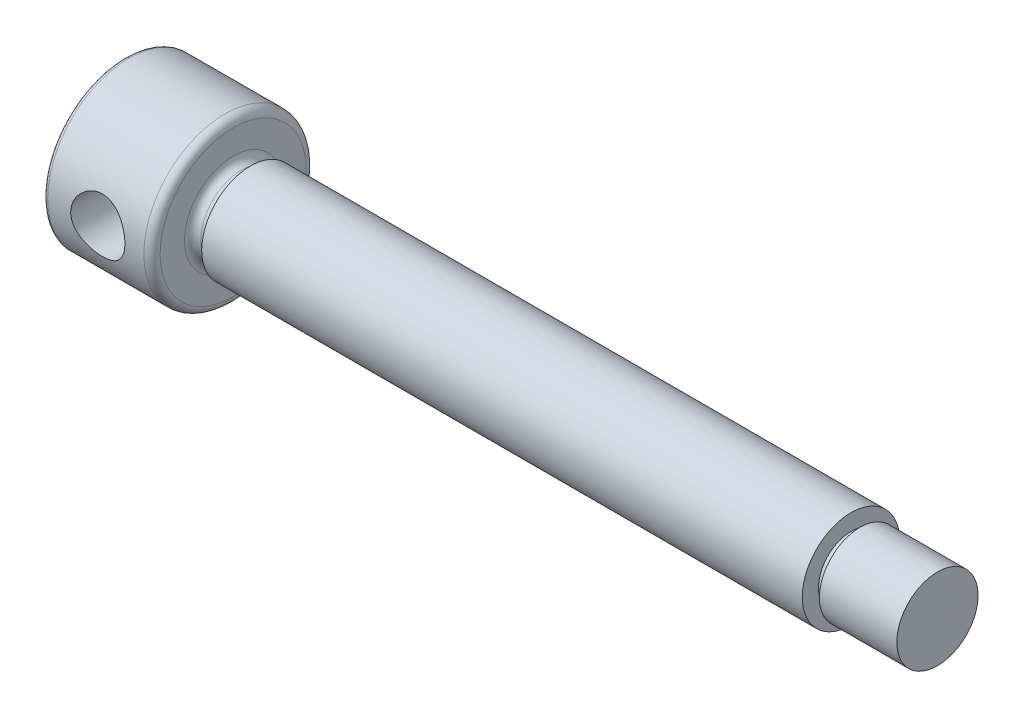
ISO-10303-21;
HEADER;
FILE_DESCRIPTION(('STEP AP214'),'2;1');
FILE_NAME('part.step','',(''),(''),'','','');
FILE_SCHEMA(('AUTOMOTIVE_DESIGN { 1 0 10303 214 1 1 1 1 }'));
ENDSEC;
DATA;
#1=APPLICATION_CONTEXT('core data for automotive mechanical design processes');
#2=APPLICATION_PROTOCOL_DEFINITION('international standard','automotive_design',2000,#1);
#3=PRODUCT_CONTEXT('',#1,'mechanical');
#4=PRODUCT('Part','Part','',(#3));
#5=PRODUCT_RELATED_PRODUCT_CATEGORY('part','',(#4));
#6=PRODUCT_DEFINITION_FORMATION('','',#4);
#7=PRODUCT_DEFINITION_CONTEXT('part definition',#1,'design');
#8=PRODUCT_DEFINITION('design','',#6,#7);
#9=PRODUCT_DEFINITION_SHAPE('','',#8);
#10=(LENGTH_UNIT() NAMED_UNIT(*) SI_UNIT(.MILLI.,.METRE.));
#11=(NAMED_UNIT(*) PLANE_ANGLE_UNIT() SI_UNIT($,.RADIAN.));
#12=(NAMED_UNIT(*) SI_UNIT($,.STERADIAN.) SOLID_ANGLE_UNIT());
#13=UNCERTAINTY_MEASURE_WITH_UNIT(LENGTH_MEASURE(1.E-05),#10,'distance_accuracy_value','');
#14=(GEOMETRIC_REPRESENTATION_CONTEXT(3) GLOBAL_UNCERTAINTY_ASSIGNED_CONTEXT((#13)) GLOBAL_UNIT_ASSIGNED_CONTEXT((#10,
#11,#12)) REPRESENTATION_CONTEXT('',''));
#15=CARTESIAN_POINT('',(0.,0.,0.));
#16=DIRECTION('',(0.,0.,1.));
#17=DIRECTION('',(1.,0.,0.));
#18=AXIS2_PLACEMENT_3D('',#15,#16,#17);
#19=CARTESIAN_POINT('',(0.,30.,0.));
#20=DIRECTION('',(1.,0.,0.));
#21=DIRECTION('',(0.,0.,-1.));
#22=AXIS2_PLACEMENT_3D('',#19,#20,#21);
#23=PLANE('',#22);
#24=CARTESIAN_POINT('',(0.,0.,0.));
#25=DIRECTION('',(1.,0.,0.));
#26=DIRECTION('',(0.,0.,-1.));
#27=AXIS2_PLACEMENT_3D('',#24,#25,#26);
#28=CIRCLE('',#27,28.5);
#29=CARTESIAN_POINT('',(0.,0.,-28.5));
#30=VERTEX_POINT('',#29);
#31=EDGE_CURVE('E147',#30,#30,#28,.F.);
#32=ORIENTED_EDGE('',*,*,#31,.T.);
#33=EDGE_LOOP('',(#32));
#34=FACE_BOUND('',#33,.T.);
#35=ADVANCED_FACE('F37',(#34),#23,.F.);
#36=CARTESIAN_POINT('',(300.,0.,0.));
#37=DIRECTION('',(-1.,0.,0.));
#38=DIRECTION('',(0.,0.,1.));
#39=AXIS2_PLACEMENT_3D('',#36,#37,#38);
#40=PLANE('',#39);
#41=CARTESIAN_POINT('',(300.,0.,0.));
#42=DIRECTION('',(-1.,0.,0.));
#43=DIRECTION('',(0.,0.,1.));
#44=AXIS2_PLACEMENT_3D('',#41,#42,#43);
#45=CIRCLE('',#44,15.);
#46=CARTESIAN_POINT('',(300.,0.,15.));
#47=VERTEX_POINT('',#46);
#48=EDGE_CURVE('E148',#47,#47,#45,.T.);
#49=ORIENTED_EDGE('',*,*,#48,.F.);
#50=EDGE_LOOP('',(#49));
#51=FACE_BOUND('',#50,.T.);
#52=ADVANCED_FACE('F93',(#51),#40,.F.);
#53=CARTESIAN_POINT('',(0.,0.,0.));
#54=DIRECTION('',(-1.,0.,0.));
#55=DIRECTION('',(0.,0.,1.));
#56=AXIS2_PLACEMENT_3D('',#53,#54,#55);
#57=CYLINDRICAL_SURFACE('',#56,15.);
#58=CARTESIAN_POINT('',(271.419940235271,0.,0.));
#59=DIRECTION('',(-1.,0.,0.));
#60=DIRECTION('',(0.,0.,1.));
#61=AXIS2_PLACEMENT_3D('',#58,#59,#60);
#62=CIRCLE('',#61,15.);
#63=CARTESIAN_POINT('',(271.419940235271,0.,15.));
#64=VERTEX_POINT('',#63);
#65=EDGE_CURVE('E153',#64,#64,#62,.T.);
#66=ORIENTED_EDGE('',*,*,#65,.F.);
#67=EDGE_LOOP('',(#66));
#68=FACE_BOUND('',#67,.T.);
#69=ORIENTED_EDGE('',*,*,#48,.T.);
#70=EDGE_LOOP('',(#69));
#71=FACE_BOUND('',#70,.T.);
#72=ADVANCED_FACE('F100',(#68,#71),#57,.T.);
#73=CARTESIAN_POINT('',(271.419940235271,15.,0.));
#74=DIRECTION('',(1.,0.,0.));
#75=DIRECTION('',(0.,0.,-1.));
#76=AXIS2_PLACEMENT_3D('',#73,#74,#75);
#77=PLANE('',#76);
#78=CARTESIAN_POINT('',(271.419940235271,0.,0.));
#79=DIRECTION('',(-1.,0.,0.));
#80=DIRECTION('',(0.,0.,1.));
#81=AXIS2_PLACEMENT_3D('',#78,#79,#80);
#82=CIRCLE('',#81,12.);
#83=CARTESIAN_POINT('',(271.419940235271,0.,12.));
#84=VERTEX_POINT('',#83);
#85=EDGE_CURVE('E156',#84,#84,#82,.T.);
#86=ORIENTED_EDGE('',*,*,#85,.F.);
#87=EDGE_LOOP('',(#86));
#88=FACE_BOUND('',#87,.T.);
#89=ORIENTED_EDGE('',*,*,#65,.T.);
#90=EDGE_LOOP('',(#89));
#91=FACE_BOUND('',#90,.T.);
#92=ADVANCED_FACE('F107',(#88,#91),#77,.F.);
#93=CARTESIAN_POINT('',(0.,0.,0.));
#94=DIRECTION('',(-1.,0.,0.));
#95=DIRECTION('',(0.,0.,1.));
#96=AXIS2_PLACEMENT_3D('',#93,#94,#95);
#97=CYLINDRICAL_SURFACE('',#96,12.);
#98=CARTESIAN_POINT('',(268.089940235271,0.,0.));
#99=DIRECTION('',(-1.,0.,0.));
#100=DIRECTION('',(0.,0.,1.));
#101=AXIS2_PLACEMENT_3D('',#98,#99,#100);
#102=CIRCLE('',#101,12.);
#103=CARTESIAN_POINT('',(268.089940235271,0.,12.));
#104=VERTEX_POINT('',#103);
#105=EDGE_CURVE('E159',#104,#104,#102,.T.);
#106=ORIENTED_EDGE('',*,*,#105,.F.);
#107=EDGE_LOOP('',(#106));
#108=FACE_BOUND('',#107,.T.);
#109=ORIENTED_EDGE('',*,*,#85,.T.);
#110=EDGE_LOOP('',(#109));
#111=FACE_BOUND('',#110,.T.);
#112=ADVANCED_FACE('F111',(#108,#111),#97,.T.);
#113=CARTESIAN_POINT('',(268.089940235271,12.,0.));
#114=DIRECTION('',(-1.,0.,0.));
#115=DIRECTION('',(0.,0.,1.));
#116=AXIS2_PLACEMENT_3D('',#113,#114,#115);
#117=PLANE('',#116);
#118=CARTESIAN_POINT('',(268.089940235271,0.,0.));
#119=DIRECTION('',(-1.,0.,0.));
#120=DIRECTION('',(0.,0.,1.));
#121=AXIS2_PLACEMENT_3D('',#118,#119,#120);
#122=CIRCLE('',#121,18.);
#123=CARTESIAN_POINT('',(268.089940235271,0.,18.));
#124=VERTEX_POINT('',#123);
#125=EDGE_CURVE('E162',#124,#124,#122,.T.);
#126=ORIENTED_EDGE('',*,*,#125,.F.);
#127=EDGE_LOOP('',(#126));
#128=FACE_BOUND('',#127,.T.);
#129=ORIENTED_EDGE('',*,*,#105,.T.);
#130=EDGE_LOOP('',(#129));
#131=FACE_BOUND('',#130,.T.);
#132=ADVANCED_FACE('F115',(#128,#131),#117,.F.);
#133=CARTESIAN_POINT('',(0.,0.,0.));
#134=DIRECTION('',(-1.,0.,0.));
#135=DIRECTION('',(0.,0.,1.));
#136=AXIS2_PLACEMENT_3D('',#133,#134,#135);
#137=CYLINDRICAL_SURFACE('',#136,18.);
#138=CARTESIAN_POINT('',(46.35,0.,0.));
#139=DIRECTION('',(-1.,0.,0.));
#140=DIRECTION('',(0.,0.,1.));
#141=AXIS2_PLACEMENT_3D('',#138,#139,#140);
#142=CIRCLE('',#141,18.);
#143=CARTESIAN_POINT('',(46.35,0.,18.));
#144=VERTEX_POINT('',#143);
#145=EDGE_CURVE('E165',#144,#144,#142,.T.);
#146=ORIENTED_EDGE('',*,*,#145,.F.);
#147=EDGE_LOOP('',(#146));
#148=FACE_BOUND('',#147,.T.);
#149=ORIENTED_EDGE('',*,*,#125,.T.);
#150=EDGE_LOOP('',(#149));
#151=FACE_BOUND('',#150,.T.);
#152=ADVANCED_FACE('F119',(#148,#151),#137,.T.);
#153=CARTESIAN_POINT('',(46.35,18.,0.));
#154=DIRECTION('',(1.,0.,0.));
#155=DIRECTION('',(0.,0.,-1.));
#156=AXIS2_PLACEMENT_3D('',#153,#154,#155);
#157=PLANE('',#156);
#158=CARTESIAN_POINT('',(46.35,0.,0.));
#159=DIRECTION('',(-1.,0.,0.));
#160=DIRECTION('',(0.,0.,1.));
#161=AXIS2_PLACEMENT_3D('',#158,#159,#160);
#162=CIRCLE('',#161,15.);
#163=CARTESIAN_POINT('',(46.35,0.,15.));
#164=VERTEX_POINT('',#163);
#165=EDGE_CURVE('E66',#164,#164,#162,.T.);
#166=ORIENTED_EDGE('',*,*,#165,.F.);
#167=EDGE_LOOP('',(#166));
#168=FACE_BOUND('',#167,.T.);
#169=ORIENTED_EDGE('',*,*,#145,.T.);
#170=EDGE_LOOP('',(#169));
#171=FACE_BOUND('',#170,.T.);
#172=ADVANCED_FACE('F123',(#168,#171),#157,.F.);
#173=CARTESIAN_POINT('',(0.,0.,0.));
#174=DIRECTION('',(-1.,0.,0.));
#175=DIRECTION('',(0.,0.,1.));
#176=AXIS2_PLACEMENT_3D('',#173,#174,#175);
#177=CYLINDRICAL_SURFACE('',#176,15.);
#178=CARTESIAN_POINT('',(43.,0.,0.));
#179=DIRECTION('',(-1.,0.,0.));
#180=DIRECTION('',(0.,0.,1.));
#181=AXIS2_PLACEMENT_3D('',#178,#179,#180);
#182=CIRCLE('',#181,15.);
#183=CARTESIAN_POINT('',(43.,0.,15.));
#184=VERTEX_POINT('',#183);
#185=EDGE_CURVE('E48',#184,#184,#182,.F.);
#186=ORIENTED_EDGE('',*,*,#185,.T.);
#187=EDGE_LOOP('',(#186));
#188=FACE_BOUND('',#187,.T.);
#189=ORIENTED_EDGE('',*,*,#165,.T.);
#190=EDGE_LOOP('',(#189));
#191=FACE_BOUND('',#190,.T.);
#192=ADVANCED_FACE('F126',(#188,#191),#177,.T.);
#193=CARTESIAN_POINT('',(40.,15.,0.));
#194=DIRECTION('',(-1.,0.,0.));
#195=DIRECTION('',(0.,0.,1.));
#196=AXIS2_PLACEMENT_3D('',#193,#194,#195);
#197=PLANE('',#196);
#198=CARTESIAN_POINT('',(40.,0.,0.));
#199=DIRECTION('',(-1.,0.,0.));
#200=DIRECTION('',(0.,0.,1.));
#201=AXIS2_PLACEMENT_3D('',#198,#199,#200);
#202=CIRCLE('',#201,27.);
#203=CARTESIAN_POINT('',(40.,0.,27.));
#204=VERTEX_POINT('',#203);
#205=EDGE_CURVE('E10',#204,#204,#202,.F.);
#206=ORIENTED_EDGE('',*,*,#205,.T.);
#207=EDGE_LOOP('',(#206));
#208=FACE_BOUND('',#207,.T.);
#209=CARTESIAN_POINT('',(40.,0.,0.));
#210=DIRECTION('',(-1.,0.,0.));
#211=DIRECTION('',(0.,0.,1.));
#212=AXIS2_PLACEMENT_3D('',#209,#210,#211);
#213=CIRCLE('',#212,18.);
#214=CARTESIAN_POINT('',(40.,0.,18.));
#215=VERTEX_POINT('',#214);
#216=EDGE_CURVE('E52',#215,#215,#213,.T.);
#217=ORIENTED_EDGE('',*,*,#216,.T.);
#218=EDGE_LOOP('',(#217));
#219=FACE_BOUND('',#218,.T.);
#220=ADVANCED_FACE('F128',(#208,#219),#197,.F.);
#221=CARTESIAN_POINT('',(0.,0.,0.));
#222=DIRECTION('',(-1.,0.,0.));
#223=DIRECTION('',(0.,0.,1.));
#224=AXIS2_PLACEMENT_3D('',#221,#222,#223);
#225=CYLINDRICAL_SURFACE('',#224,30.);
#226=CARTESIAN_POINT('',(37.,0.,0.));
#227=DIRECTION('',(-1.,0.,0.));
#228=DIRECTION('',(0.,0.,1.));
#229=AXIS2_PLACEMENT_3D('',#226,#227,#228);
#230=CIRCLE('',#229,30.);
#231=CARTESIAN_POINT('',(37.,0.,30.));
#232=VERTEX_POINT('',#231);
#233=EDGE_CURVE('E44',#232,#232,#230,.T.);
#234=ORIENTED_EDGE('',*,*,#233,.T.);
#235=EDGE_LOOP('',(#234));
#236=FACE_BOUND('',#235,.T.);
#237=CARTESIAN_POINT('',(30.,0.,30.));
#238=CARTESIAN_POINT('',(30.0000001104679,-0.272817421855649,30.0000000727974));
#239=CARTESIAN_POINT('',(29.9888266523667,-0.545633217756684,29.9962700139409));
#240=CARTESIAN_POINT('',(29.9442413958574,-1.08923625252841,29.9814525321439));
#241=CARTESIAN_POINT('',(29.9108297781762,-1.36002350786673,29.9703651689954));
#242=CARTESIAN_POINT('',(29.8220822374092,-1.89761112302447,29.9411347007489));
#243=CARTESIAN_POINT('',(29.7667446109079,-2.16441117140915,29.922991047455));
#244=CARTESIAN_POINT('',(29.6346518387313,-2.69211184449215,29.8801375011105));
#245=CARTESIAN_POINT('',(29.5578965476063,-2.95301242911357,29.8554275634677));
#246=CARTESIAN_POINT('',(29.3838026740723,-3.46664728525619,29.8001502927581));
#247=CARTESIAN_POINT('',(29.2865034902221,-3.71939613546444,29.769594181714));
#248=CARTESIAN_POINT('',(29.0719867410987,-4.2157054038381,29.7033758431392));
#249=CARTESIAN_POINT('',(28.9547618038682,-4.45926238037108,29.6677117265642));
#250=CARTESIAN_POINT('',(28.7013132201959,-4.93557741320288,29.5921987127881));
#251=CARTESIAN_POINT('',(28.5650906781184,-5.16833609617821,29.5523500588748));
#252=CARTESIAN_POINT('',(28.2745905228092,-5.62171195987546,29.4694667799179));
#253=CARTESIAN_POINT('',(28.1203118241659,-5.84232840951691,29.4264319634014));
#254=CARTESIAN_POINT('',(27.7896247247178,-6.27682953459761,29.3368734013662));
#255=CARTESIAN_POINT('',(27.6126759880062,-6.49028930660537,29.29028268856));
#256=CARTESIAN_POINT('',(27.2417996008254,-6.90166928730257,29.1960870485027));
#257=CARTESIAN_POINT('',(27.0478716671758,-7.09958923671302,29.1484821043462));
#258=CARTESIAN_POINT('',(26.644187198448,-7.4787345360743,29.0535150777194));
#259=CARTESIAN_POINT('',(26.4344270648865,-7.65995606974808,29.0061530530903));
#260=CARTESIAN_POINT('',(26.0003833013844,-8.00450980543821,28.9129673550339));
#261=CARTESIAN_POINT('',(25.7761000429094,-8.16784246472038,28.8671436423059));
#262=CARTESIAN_POINT('',(25.307627620987,-8.48001162237398,28.7770145745701));
#263=CARTESIAN_POINT('',(25.0630494088315,-8.62828897719031,28.7327920322828));
#264=CARTESIAN_POINT('',(24.561607951453,-8.90356690608016,28.6486860707732));
#265=CARTESIAN_POINT('',(24.3047496061247,-9.03057587685659,28.6088009413422));
#266=CARTESIAN_POINT('',(23.7803993366107,-9.26232893823766,28.534611919855));
#267=CARTESIAN_POINT('',(23.5129077165078,-9.36707366499654,28.5003078683376));
#268=CARTESIAN_POINT('',(22.9692040524567,-9.55334459189201,28.4384115850147));
#269=CARTESIAN_POINT('',(22.692992401599,-9.63487183699472,28.4108190511471));
#270=CARTESIAN_POINT('',(22.1433639211935,-9.77156399073686,28.3640896180245));
#271=CARTESIAN_POINT('',(21.8701664913576,-9.82752458111658,28.3446991444855));
#272=CARTESIAN_POINT('',(21.319617177656,-9.91646893957756,28.3137046439995));
#273=CARTESIAN_POINT('',(21.042265380201,-9.94945318488935,28.3021004553276));
#274=CARTESIAN_POINT('',(20.4856273063419,-9.99210001297699,28.2870721491151));
#275=CARTESIAN_POINT('',(20.2063415667797,-10.001768826595,28.2836458461098));
#276=CARTESIAN_POINT('',(19.6479662400752,-9.99770051099411,28.2850842635986));
#277=CARTESIAN_POINT('',(19.3688766476204,-9.98396404222416,28.2899487501436));
#278=CARTESIAN_POINT('',(18.8258185571162,-9.93439524598055,28.3073918779751));
#279=CARTESIAN_POINT('',(18.5617426267179,-9.89960301642487,28.319607253905));
#280=CARTESIAN_POINT('',(18.0376215889632,-9.80916853998116,28.3510582066347));
#281=CARTESIAN_POINT('',(17.777576340707,-9.7535270236365,28.3702935374598));
#282=CARTESIAN_POINT('',(17.2632912481491,-9.62189570023088,28.4152063218622));
#283=CARTESIAN_POINT('',(17.009050859133,-9.54590781101341,28.4408831682495));
#284=CARTESIAN_POINT('',(16.5078880967364,-9.37418519909552,28.4979443617719));
#285=CARTESIAN_POINT('',(16.2609685440672,-9.27844297530628,28.529330876437));
#286=CARTESIAN_POINT('',(15.772237067919,-9.0663166164916,28.5974561704828));
#287=CARTESIAN_POINT('',(15.5305664167003,-8.94963170239518,28.6342713183779));
#288=CARTESIAN_POINT('',(15.0577897989686,-8.69749161241992,28.7118622802787));
#289=CARTESIAN_POINT('',(14.8266874781259,-8.56203002330161,28.7526394460964));
#290=CARTESIAN_POINT('',(14.3764378067254,-8.27327503440926,28.8370515032613));
#291=CARTESIAN_POINT('',(14.1572912822404,-8.11998040476689,28.8806865916162));
#292=CARTESIAN_POINT('',(13.7321864753289,-7.79652835236897,28.9696785669952));
#293=CARTESIAN_POINT('',(13.5262286466316,-7.62637034997736,29.0150355131707));
#294=CARTESIAN_POINT('',(13.1182174584067,-7.26085153575986,29.1087179470551));
#295=CARTESIAN_POINT('',(12.9169351310576,-7.06463704194718,29.1570743820817));
#296=CARTESIAN_POINT('',(12.531580418041,-6.65594240213113,29.2530762745549));
#297=CARTESIAN_POINT('',(12.3475026290649,-6.44346740133943,29.300721951247));
#298=CARTESIAN_POINT('',(11.997608072022,-6.00339730644672,29.3940440756636));
#299=CARTESIAN_POINT('',(11.8318000348253,-5.77579506581797,29.4397195755768));
#300=CARTESIAN_POINT('',(11.5197728737227,-5.30706897712641,29.5278149211553));
#301=CARTESIAN_POINT('',(11.3735459990738,-5.06595053306834,29.5702360521294));
#302=CARTESIAN_POINT('',(11.1003243634992,-4.56913058063748,29.6510879634885));
#303=CARTESIAN_POINT('',(10.9735405213375,-4.31330561219176,29.6894737298341));
#304=CARTESIAN_POINT('',(10.7420713564707,-3.79108523456436,29.7606637721347));
#305=CARTESIAN_POINT('',(10.6373863166824,-3.52468969010621,29.7934679766314));
#306=CARTESIAN_POINT('',(10.4510885271493,-2.98332200960532,29.8525359450835));
#307=CARTESIAN_POINT('',(10.3694692782669,-2.70835231375462,29.8788015511394));
#308=CARTESIAN_POINT('',(10.2300560036121,-2.15185145897869,29.92402797464));
#309=CARTESIAN_POINT('',(10.1722608812851,-1.87032060267475,29.9429891282845));
#310=CARTESIAN_POINT('',(10.0830583762764,-1.31523069421227,29.9723879768698));
#311=CARTESIAN_POINT('',(10.050615367746,-1.04185537515,29.9831596368278));
#312=CARTESIAN_POINT('',(10.0083792858962,-0.493170936320498,29.9972012675858));
#313=CARTESIAN_POINT('',(9.99858555708838,-0.217861872748698,30.0004714554843));
#314=CARTESIAN_POINT('',(10.0017433831611,0.332568031007705,29.9994188985649));
#315=CARTESIAN_POINT('',(10.0146915114979,0.607688893300782,29.9950972976112));
#316=CARTESIAN_POINT('',(10.0631992209163,1.15570622136198,29.9789840848465));
#317=CARTESIAN_POINT('',(10.0987585736551,1.42860270956509,29.9671925484717));
#318=CARTESIAN_POINT('',(10.1907787821032,1.96222703239708,29.9369169558084));
#319=CARTESIAN_POINT('',(10.2465987120614,2.22307746287105,29.9186384657949));
#320=CARTESIAN_POINT('',(10.3787575509438,2.73909747094249,29.8758162932983));
#321=CARTESIAN_POINT('',(10.4551037635981,2.99426499136465,29.8512703808768));
#322=CARTESIAN_POINT('',(10.627646328962,3.49708740595829,29.7965488926633));
#323=CARTESIAN_POINT('',(10.7238370604955,3.74474440483059,29.7663749113147));
#324=CARTESIAN_POINT('',(10.9353702712062,4.23117712889609,29.7011345010077));
#325=CARTESIAN_POINT('',(11.050720116823,4.46994939463069,29.6660661910728));
#326=CARTESIAN_POINT('',(11.3029319865395,4.94315066961522,29.5909467676433));
#327=CARTESIAN_POINT('',(11.4402734803096,5.17730735950409,29.5507901885031));
#328=CARTESIAN_POINT('',(11.7332922577065,5.63338688490355,29.4672484943862));
#329=CARTESIAN_POINT('',(11.8889777330974,5.85530418930658,29.423861940227));
#330=CARTESIAN_POINT('',(12.2176166598181,6.28552190327163,29.3349700920827));
#331=CARTESIAN_POINT('',(12.3905708917514,6.49382169657322,29.2894647023692));
#332=CARTESIAN_POINT('',(12.7526733105245,6.89560723699441,29.1974842079415));
#333=CARTESIAN_POINT('',(12.941821920915,7.08909259640374,29.1510090778886));
#334=CARTESIAN_POINT('',(13.3441947029294,7.46861368298098,29.0561491129105));
#335=CARTESIAN_POINT('',(13.5581240383975,7.65390507082137,29.007774048611));
#336=CARTESIAN_POINT('',(14.001053721045,8.00578656049348,28.9126373623233));
#337=CARTESIAN_POINT('',(14.2300486419341,8.17238333784561,28.865875168565));
#338=CARTESIAN_POINT('',(14.7018574573737,8.48586679285761,28.7752794226619));
#339=CARTESIAN_POINT('',(14.9446772903351,8.63274490811907,28.7314471468913));
#340=CARTESIAN_POINT('',(15.4423930021589,8.90554413202635,28.6480650290242));
#341=CARTESIAN_POINT('',(15.6972837746505,9.03147400245094,28.6085133989423));
#342=CARTESIAN_POINT('',(16.2170782306002,9.26121465963451,28.5349686573375));
#343=CARTESIAN_POINT('',(16.4819633305474,9.36506432595329,28.5009658003202));
#344=CARTESIAN_POINT('',(17.0203169958056,9.54999948685702,28.4395326253181));
#345=CARTESIAN_POINT('',(17.2937855900695,9.63108490464717,28.4121023295056));
#346=CARTESIAN_POINT('',(17.8471667717795,9.76967941183168,28.364744570705));
#347=CARTESIAN_POINT('',(18.1270768867932,9.82719739275427,28.3448142783458));
#348=CARTESIAN_POINT('',(18.691242348877,9.91810350429491,28.3131339062987));
#349=CARTESIAN_POINT('',(18.9754974762297,9.95149285094855,28.301383414366));
#350=CARTESIAN_POINT('',(19.5313663836579,9.99269827789952,28.2868595572535));
#351=CARTESIAN_POINT('',(19.8028786926903,10.0017409386727,28.2836556970276));
#352=CARTESIAN_POINT('',(20.3457124952811,9.99770707019235,28.2850819532403));
#353=CARTESIAN_POINT('',(20.6170339953448,9.98463133564125,28.2897117882182));
#354=CARTESIAN_POINT('',(21.1574554852446,9.9364928064115,28.3066557004955));
#355=CARTESIAN_POINT('',(21.426555612442,9.90143138172029,28.3189692989986));
#356=CARTESIAN_POINT('',(21.9605963770422,9.80966197710057,28.3508886380516));
#357=CARTESIAN_POINT('',(22.2255370011434,9.75295392796379,28.3704944019159));
#358=CARTESIAN_POINT('',(22.7443545709811,9.61971250162803,28.4159458608578));
#359=CARTESIAN_POINT('',(22.9983463096881,9.54358162889864,28.441664218809));
#360=CARTESIAN_POINT('',(23.4990030549066,9.3716093890319,28.498791950436));
#361=CARTESIAN_POINT('',(23.7456654257493,9.27576102727379,28.5302033431982));
#362=CARTESIAN_POINT('',(24.23006103195,9.0651164728258,28.597830166649));
#363=CARTESIAN_POINT('',(24.4677945733622,8.95032093031891,28.6340454324816));
#364=CARTESIAN_POINT('',(24.9329845529021,8.7025924785274,28.7103060608169));
#365=CARTESIAN_POINT('',(25.160440289649,8.56965833390417,28.7503516841324));
#366=CARTESIAN_POINT('',(25.6134815254137,8.28034879297644,28.8350396975525));
#367=CARTESIAN_POINT('',(25.8385525409484,8.12320375674414,28.8798064098721));
#368=CARTESIAN_POINT('',(26.274796355551,7.79115386497401,28.9711505527338));
#369=CARTESIAN_POINT('',(26.4859688258691,7.61624858959245,29.0177280260653));
#370=CARTESIAN_POINT('',(26.8932342213525,7.24971676169647,29.1114649338633));
#371=CARTESIAN_POINT('',(27.0893230431879,7.05808568917761,29.1586245226669));
#372=CARTESIAN_POINT('',(27.4651796743633,6.65929199916924,29.2522781356485));
#373=CARTESIAN_POINT('',(27.6449476900323,6.45212957808884,29.2987721682343));
#374=CARTESIAN_POINT('',(27.9937657443444,6.01505765691601,29.3916811895353));
#375=CARTESIAN_POINT('',(28.1621176990621,5.78457436071791,29.4380213798086));
#376=CARTESIAN_POINT('',(28.4787090683785,5.30969823861295,29.5273677523704));
#377=CARTESIAN_POINT('',(28.6269560178353,5.06531067269805,29.5703751810909));
#378=CARTESIAN_POINT('',(28.9022628234117,4.56414864864736,29.6518631526816));
#379=CARTESIAN_POINT('',(29.0293225855371,4.30737413556508,29.6903436754686));
#380=CARTESIAN_POINT('',(29.2611782059596,3.78321180102571,29.7616741137116));
#381=CARTESIAN_POINT('',(29.3659752171987,3.51582453003312,29.7945243207331));
#382=CARTESIAN_POINT('',(29.5481922470328,2.98451649561972,29.8523172984574));
#383=CARTESIAN_POINT('',(29.6266261591357,2.72097451656309,29.877547765761));
#384=CARTESIAN_POINT('',(29.761615917993,2.1878001940133,29.9213145214249));
#385=CARTESIAN_POINT('',(29.8181724828281,1.91816805072525,29.9398510294998));
#386=CARTESIAN_POINT('',(29.9088695791786,1.37482625392578,29.9697157235778));
#387=CARTESIAN_POINT('',(29.9430152864708,1.10111755683676,29.9810455739363));
#388=CARTESIAN_POINT('',(29.9885804097446,0.551605348742875,29.9961876649972));
#389=CARTESIAN_POINT('',(29.9999998883236,0.275801843510097,29.9999999264062));
#390=CARTESIAN_POINT('',(30.,0.,30.));
#391=B_SPLINE_CURVE_WITH_KNOTS('',3,(#237,#238,#239,#240,#241,#242,#243,#244,#245,#246,#247,
#248,#249,#250,#251,#252,#253,#254,#255,#256,#257,#258,#259,#260,#261,#262,#263,#264,#265,#266,
#267,#268,#269,#270,#271,#272,#273,#274,#275,#276,#277,#278,#279,#280,#281,#282,#283,#284,#285,
#286,#287,#288,#289,#290,#291,#292,#293,#294,#295,#296,#297,#298,#299,#300,#301,#302,#303,#304,
#305,#306,#307,#308,#309,#310,#311,#312,#313,#314,#315,#316,#317,#318,#319,#320,#321,#322,#323,
#324,#325,#326,#327,#328,#329,#330,#331,#332,#333,#334,#335,#336,#337,#338,#339,#340,#341,#342,
#343,#344,#345,#346,#347,#348,#349,#350,#351,#352,#353,#354,#355,#356,#357,#358,#359,#360,#361,
#362,#363,#364,#365,#366,#367,#368,#369,#370,#371,#372,#373,#374,#375,#376,#377,#378,#379,#380,
#381,#382,#383,#384,#385,#386,#387,#388,#389,#390),.UNSPECIFIED.,.T.,.F.,(4,2,2,2,2,2,2,2,2,2,2,
2,2,2,2,2,2,2,2,2,2,2,2,2,2,2,2,2,2,2,2,2,2,2,2,2,2,2,2,2,2,2,2,2,2,2,2,2,2,2,2,2,2,2,2,2,2,2,2,
2,2,2,2,2,2,2,2,2,2,2,2,2,2,2,2,2,4),(0.,0.818196432007471,1.6363862147065,2.45463957443219,
3.27289849113841,4.08960219775423,4.90660872161766,5.72356777122698,6.54057595602182,
7.38307938747212,8.22559687294595,9.06830643331703,9.91099444776757,10.7781693377685,
11.645001058067,12.5118080071298,13.3785759370122,14.2161395744967,15.0536858148334,
15.8910082035541,16.7283069651494,17.5272827763208,18.3262305945964,19.1251031307666,
19.9242795738385,20.7360167087683,21.5480317816989,22.3601028890635,23.1722019190185,
24.0268844717706,24.881297691995,25.7361174700155,26.590597881189,27.453776210577,
28.3169655900159,29.1799115096585,30.0428177059962,30.8683037091444,31.6937658217619,
32.5191035716477,33.3444329868686,34.1456526351705,34.9471577542856,35.7484361493028,
36.5500233420392,37.3723552433202,38.1950557703192,39.0177935028915,39.8405527600735,
40.7009055318267,41.5609501023284,42.4213669287557,43.2814229688245,44.1399518163629,
44.998483560099,45.8566910978631,46.7148553806428,47.5288973096875,48.3429099912533,
49.1568719545403,49.9708365202357,50.7691377037427,51.5677225680383,52.3662800341472,
53.1648919135846,53.9983437551269,54.8318153036679,55.665512792355,56.4991997398996,
57.3656243250608,58.2317232930636,59.0978261032941,59.9638840489003,60.7912515257116,
61.618591843516,62.4457410201728,63.2728879185129),.UNSPECIFIED.);
#392=CARTESIAN_POINT('',(30.,0.,30.));
#393=VERTEX_POINT('',#392);
#394=EDGE_CURVE('E58',#393,#393,#391,.T.);
#395=ORIENTED_EDGE('',*,*,#394,.T.);
#396=EDGE_LOOP('',(#395));
#397=FACE_BOUND('',#396,.T.);
#398=CARTESIAN_POINT('',(30.,0.,-30.));
#399=CARTESIAN_POINT('',(30.0000001104679,0.272817421855649,-30.0000000727974));
#400=CARTESIAN_POINT('',(29.9888266523667,0.545633217756684,-29.9962700139409));
#401=CARTESIAN_POINT('',(29.9442413958574,1.08923625252841,-29.9814525321439));
#402=CARTESIAN_POINT('',(29.9108297781762,1.36002350786673,-29.9703651689954));
#403=CARTESIAN_POINT('',(29.8220822374092,1.89761112302447,-29.9411347007489));
#404=CARTESIAN_POINT('',(29.7667446109079,2.16441117140915,-29.922991047455));
#405=CARTESIAN_POINT('',(29.6346518387313,2.69211184449215,-29.8801375011105));
#406=CARTESIAN_POINT('',(29.5578965476063,2.95301242911357,-29.8554275634677));
#407=CARTESIAN_POINT('',(29.3838026740723,3.46664728525619,-29.8001502927581));
#408=CARTESIAN_POINT('',(29.2865034902221,3.71939613546444,-29.769594181714));
#409=CARTESIAN_POINT('',(29.0719867410987,4.2157054038381,-29.7033758431392));
#410=CARTESIAN_POINT('',(28.9547618038682,4.45926238037108,-29.6677117265642));
#411=CARTESIAN_POINT('',(28.7013132201959,4.93557741320288,-29.5921987127881));
#412=CARTESIAN_POINT('',(28.5650906781184,5.16833609617821,-29.5523500588748));
#413=CARTESIAN_POINT('',(28.2745905228092,5.62171195987546,-29.4694667799179));
#414=CARTESIAN_POINT('',(28.1203118241659,5.84232840951691,-29.4264319634014));
#415=CARTESIAN_POINT('',(27.7896247247178,6.27682953459761,-29.3368734013662));
#416=CARTESIAN_POINT('',(27.6126759880062,6.49028930660537,-29.29028268856));
#417=CARTESIAN_POINT('',(27.2417996008254,6.90166928730257,-29.1960870485027));
#418=CARTESIAN_POINT('',(27.0478716671758,7.09958923671302,-29.1484821043462));
#419=CARTESIAN_POINT('',(26.644187198448,7.4787345360743,-29.0535150777194));
#420=CARTESIAN_POINT('',(26.4344270648865,7.65995606974808,-29.0061530530903));
#421=CARTESIAN_POINT('',(26.0003833013844,8.00450980543821,-28.9129673550339));
#422=CARTESIAN_POINT('',(25.7761000429094,8.16784246472038,-28.8671436423059));
#423=CARTESIAN_POINT('',(25.307627620987,8.48001162237398,-28.7770145745701));
#424=CARTESIAN_POINT('',(25.0630494088315,8.62828897719031,-28.7327920322828));
#425=CARTESIAN_POINT('',(24.561607951453,8.90356690608016,-28.6486860707732));
#426=CARTESIAN_POINT('',(24.3047496061247,9.03057587685659,-28.6088009413422));
#427=CARTESIAN_POINT('',(23.7803993366107,9.26232893823766,-28.534611919855));
#428=CARTESIAN_POINT('',(23.5129077165078,9.36707366499654,-28.5003078683376));
#429=CARTESIAN_POINT('',(22.9692040524567,9.55334459189201,-28.4384115850147));
#430=CARTESIAN_POINT('',(22.692992401599,9.63487183699472,-28.4108190511471));
#431=CARTESIAN_POINT('',(22.1433639211935,9.77156399073686,-28.3640896180245));
#432=CARTESIAN_POINT('',(21.8701664913576,9.82752458111658,-28.3446991444855));
#433=CARTESIAN_POINT('',(21.319617177656,9.91646893957756,-28.3137046439995));
#434=CARTESIAN_POINT('',(21.042265380201,9.94945318488935,-28.3021004553276));
#435=CARTESIAN_POINT('',(20.4856273063419,9.99210001297699,-28.2870721491151));
#436=CARTESIAN_POINT('',(20.2063415667797,10.001768826595,-28.2836458461098));
#437=CARTESIAN_POINT('',(19.6479662400752,9.99770051099411,-28.2850842635986));
#438=CARTESIAN_POINT('',(19.3688766476204,9.98396404222416,-28.2899487501436));
#439=CARTESIAN_POINT('',(18.8258185571162,9.93439524598055,-28.3073918779751));
#440=CARTESIAN_POINT('',(18.5617426267179,9.89960301642487,-28.319607253905));
#441=CARTESIAN_POINT('',(18.0376215889632,9.80916853998116,-28.3510582066347));
#442=CARTESIAN_POINT('',(17.777576340707,9.7535270236365,-28.3702935374598));
#443=CARTESIAN_POINT('',(17.2632912481491,9.62189570023088,-28.4152063218622));
#444=CARTESIAN_POINT('',(17.009050859133,9.54590781101341,-28.4408831682495));
#445=CARTESIAN_POINT('',(16.5078880967364,9.37418519909552,-28.4979443617719));
#446=CARTESIAN_POINT('',(16.2609685440672,9.27844297530628,-28.529330876437));
#447=CARTESIAN_POINT('',(15.772237067919,9.0663166164916,-28.5974561704828));
#448=CARTESIAN_POINT('',(15.5305664167003,8.94963170239518,-28.6342713183779));
#449=CARTESIAN_POINT('',(15.0577897989686,8.69749161241992,-28.7118622802787));
#450=CARTESIAN_POINT('',(14.8266874781259,8.56203002330161,-28.7526394460964));
#451=CARTESIAN_POINT('',(14.3764378067254,8.27327503440926,-28.8370515032613));
#452=CARTESIAN_POINT('',(14.1572912822404,8.11998040476689,-28.8806865916162));
#453=CARTESIAN_POINT('',(13.7321864753289,7.79652835236897,-28.9696785669952));
#454=CARTESIAN_POINT('',(13.5262286466316,7.62637034997736,-29.0150355131707));
#455=CARTESIAN_POINT('',(13.1182174584067,7.26085153575986,-29.1087179470551));
#456=CARTESIAN_POINT('',(12.9169351310576,7.06463704194718,-29.1570743820817));
#457=CARTESIAN_POINT('',(12.531580418041,6.65594240213113,-29.2530762745549));
#458=CARTESIAN_POINT('',(12.3475026290649,6.44346740133943,-29.300721951247));
#459=CARTESIAN_POINT('',(11.997608072022,6.00339730644672,-29.3940440756636));
#460=CARTESIAN_POINT('',(11.8318000348253,5.77579506581797,-29.4397195755768));
#461=CARTESIAN_POINT('',(11.5197728737227,5.30706897712641,-29.5278149211553));
#462=CARTESIAN_POINT('',(11.3735459990738,5.06595053306834,-29.5702360521294));
#463=CARTESIAN_POINT('',(11.1003243634992,4.56913058063748,-29.6510879634885));
#464=CARTESIAN_POINT('',(10.9735405213375,4.31330561219176,-29.6894737298341));
#465=CARTESIAN_POINT('',(10.7420713564707,3.79108523456436,-29.7606637721347));
#466=CARTESIAN_POINT('',(10.6373863166824,3.52468969010621,-29.7934679766314));
#467=CARTESIAN_POINT('',(10.4510885271493,2.98332200960532,-29.8525359450835));
#468=CARTESIAN_POINT('',(10.3694692782669,2.70835231375462,-29.8788015511394));
#469=CARTESIAN_POINT('',(10.2300560036121,2.15185145897869,-29.92402797464));
#470=CARTESIAN_POINT('',(10.1722608812851,1.87032060267475,-29.9429891282845));
#471=CARTESIAN_POINT('',(10.0830583762764,1.31523069421227,-29.9723879768698));
#472=CARTESIAN_POINT('',(10.050615367746,1.04185537515,-29.9831596368278));
#473=CARTESIAN_POINT('',(10.0083792858962,0.493170936320498,-29.9972012675858));
#474=CARTESIAN_POINT('',(9.99858555708838,0.217861872748698,-30.0004714554843));
#475=CARTESIAN_POINT('',(10.0017433831611,-0.332568031007705,-29.9994188985649));
#476=CARTESIAN_POINT('',(10.0146915114979,-0.607688893300782,-29.9950972976112));
#477=CARTESIAN_POINT('',(10.0631992209163,-1.15570622136198,-29.9789840848465));
#478=CARTESIAN_POINT('',(10.0987585736551,-1.42860270956509,-29.9671925484717));
#479=CARTESIAN_POINT('',(10.1907787821032,-1.96222703239708,-29.9369169558084));
#480=CARTESIAN_POINT('',(10.2465987120614,-2.22307746287105,-29.9186384657949));
#481=CARTESIAN_POINT('',(10.3787575509438,-2.73909747094249,-29.8758162932983));
#482=CARTESIAN_POINT('',(10.4551037635981,-2.99426499136465,-29.8512703808768));
#483=CARTESIAN_POINT('',(10.627646328962,-3.49708740595829,-29.7965488926633));
#484=CARTESIAN_POINT('',(10.7238370604955,-3.74474440483059,-29.7663749113147));
#485=CARTESIAN_POINT('',(10.9353702712062,-4.23117712889609,-29.7011345010077));
#486=CARTESIAN_POINT('',(11.050720116823,-4.46994939463069,-29.6660661910728));
#487=CARTESIAN_POINT('',(11.3029319865395,-4.94315066961522,-29.5909467676433));
#488=CARTESIAN_POINT('',(11.4402734803096,-5.17730735950409,-29.5507901885031));
#489=CARTESIAN_POINT('',(11.7332922577065,-5.63338688490355,-29.4672484943862));
#490=CARTESIAN_POINT('',(11.8889777330974,-5.85530418930658,-29.423861940227));
#491=CARTESIAN_POINT('',(12.2176166598181,-6.28552190327163,-29.3349700920827));
#492=CARTESIAN_POINT('',(12.3905708917514,-6.49382169657322,-29.2894647023692));
#493=CARTESIAN_POINT('',(12.7526733105245,-6.89560723699441,-29.1974842079415));
#494=CARTESIAN_POINT('',(12.941821920915,-7.08909259640374,-29.1510090778886));
#495=CARTESIAN_POINT('',(13.3441947029294,-7.46861368298098,-29.0561491129105));
#496=CARTESIAN_POINT('',(13.5581240383975,-7.65390507082137,-29.007774048611));
#497=CARTESIAN_POINT('',(14.001053721045,-8.00578656049348,-28.9126373623233));
#498=CARTESIAN_POINT('',(14.2300486419341,-8.17238333784561,-28.865875168565));
#499=CARTESIAN_POINT('',(14.7018574573737,-8.48586679285761,-28.7752794226619));
#500=CARTESIAN_POINT('',(14.9446772903351,-8.63274490811907,-28.7314471468913));
#501=CARTESIAN_POINT('',(15.4423930021589,-8.90554413202635,-28.6480650290242));
#502=CARTESIAN_POINT('',(15.6972837746505,-9.03147400245094,-28.6085133989423));
#503=CARTESIAN_POINT('',(16.2170782306002,-9.26121465963451,-28.5349686573375));
#504=CARTESIAN_POINT('',(16.4819633305474,-9.36506432595329,-28.5009658003202));
#505=CARTESIAN_POINT('',(17.0203169958056,-9.54999948685702,-28.4395326253181));
#506=CARTESIAN_POINT('',(17.2937855900695,-9.63108490464717,-28.4121023295056));
#507=CARTESIAN_POINT('',(17.8471667717795,-9.76967941183168,-28.364744570705));
#508=CARTESIAN_POINT('',(18.1270768867932,-9.82719739275427,-28.3448142783458));
#509=CARTESIAN_POINT('',(18.691242348877,-9.91810350429491,-28.3131339062987));
#510=CARTESIAN_POINT('',(18.9754974762297,-9.95149285094855,-28.301383414366));
#511=CARTESIAN_POINT('',(19.5313663836579,-9.99269827789952,-28.2868595572535));
#512=CARTESIAN_POINT('',(19.8028786926903,-10.0017409386727,-28.2836556970276));
#513=CARTESIAN_POINT('',(20.3457124952811,-9.99770707019235,-28.2850819532403));
#514=CARTESIAN_POINT('',(20.6170339953448,-9.98463133564125,-28.2897117882182));
#515=CARTESIAN_POINT('',(21.1574554852446,-9.9364928064115,-28.3066557004955));
#516=CARTESIAN_POINT('',(21.426555612442,-9.90143138172029,-28.3189692989986));
#517=CARTESIAN_POINT('',(21.9605963770422,-9.80966197710057,-28.3508886380516));
#518=CARTESIAN_POINT('',(22.2255370011434,-9.75295392796379,-28.3704944019159));
#519=CARTESIAN_POINT('',(22.7443545709811,-9.61971250162803,-28.4159458608578));
#520=CARTESIAN_POINT('',(22.9983463096881,-9.54358162889864,-28.441664218809));
#521=CARTESIAN_POINT('',(23.4990030549066,-9.3716093890319,-28.498791950436));
#522=CARTESIAN_POINT('',(23.7456654257493,-9.27576102727379,-28.5302033431982));
#523=CARTESIAN_POINT('',(24.23006103195,-9.0651164728258,-28.597830166649));
#524=CARTESIAN_POINT('',(24.4677945733622,-8.95032093031891,-28.6340454324816));
#525=CARTESIAN_POINT('',(24.9329845529021,-8.7025924785274,-28.7103060608169));
#526=CARTESIAN_POINT('',(25.160440289649,-8.56965833390417,-28.7503516841324));
#527=CARTESIAN_POINT('',(25.6134815254137,-8.28034879297644,-28.8350396975525));
#528=CARTESIAN_POINT('',(25.8385525409484,-8.12320375674414,-28.8798064098721));
#529=CARTESIAN_POINT('',(26.274796355551,-7.79115386497401,-28.9711505527338));
#530=CARTESIAN_POINT('',(26.4859688258691,-7.61624858959245,-29.0177280260653));
#531=CARTESIAN_POINT('',(26.8932342213525,-7.24971676169647,-29.1114649338633));
#532=CARTESIAN_POINT('',(27.0893230431879,-7.05808568917761,-29.1586245226669));
#533=CARTESIAN_POINT('',(27.4651796743633,-6.65929199916924,-29.2522781356485));
#534=CARTESIAN_POINT('',(27.6449476900323,-6.45212957808884,-29.2987721682343));
#535=CARTESIAN_POINT('',(27.9937657443444,-6.01505765691601,-29.3916811895353));
#536=CARTESIAN_POINT('',(28.1621176990621,-5.78457436071791,-29.4380213798086));
#537=CARTESIAN_POINT('',(28.4787090683785,-5.30969823861295,-29.5273677523704));
#538=CARTESIAN_POINT('',(28.6269560178353,-5.06531067269805,-29.5703751810909));
#539=CARTESIAN_POINT('',(28.9022628234117,-4.56414864864736,-29.6518631526816));
#540=CARTESIAN_POINT('',(29.0293225855371,-4.30737413556508,-29.6903436754686));
#541=CARTESIAN_POINT('',(29.2611782059596,-3.78321180102571,-29.7616741137116));
#542=CARTESIAN_POINT('',(29.3659752171987,-3.51582453003312,-29.7945243207331));
#543=CARTESIAN_POINT('',(29.5481922470328,-2.98451649561972,-29.8523172984574));
#544=CARTESIAN_POINT('',(29.6266261591357,-2.72097451656309,-29.877547765761));
#545=CARTESIAN_POINT('',(29.761615917993,-2.1878001940133,-29.9213145214249));
#546=CARTESIAN_POINT('',(29.8181724828281,-1.91816805072525,-29.9398510294998));
#547=CARTESIAN_POINT('',(29.9088695791786,-1.37482625392578,-29.9697157235778));
#548=CARTESIAN_POINT('',(29.9430152864708,-1.10111755683676,-29.9810455739363));
#549=CARTESIAN_POINT('',(29.9885804097446,-0.551605348742875,-29.9961876649972));
#550=CARTESIAN_POINT('',(29.9999998883236,-0.275801843510097,-29.9999999264062));
#551=CARTESIAN_POINT('',(30.,0.,-30.));
#552=B_SPLINE_CURVE_WITH_KNOTS('',3,(#398,#399,#400,#401,#402,#403,#404,#405,#406,#407,#408,
#409,#410,#411,#412,#413,#414,#415,#416,#417,#418,#419,#420,#421,#422,#423,#424,#425,#426,#427,
#428,#429,#430,#431,#432,#433,#434,#435,#436,#437,#438,#439,#440,#441,#442,#443,#444,#445,#446,
#447,#448,#449,#450,#451,#452,#453,#454,#455,#456,#457,#458,#459,#460,#461,#462,#463,#464,#465,
#466,#467,#468,#469,#470,#471,#472,#473,#474,#475,#476,#477,#478,#479,#480,#481,#482,#483,#484,
#485,#486,#487,#488,#489,#490,#491,#492,#493,#494,#495,#496,#497,#498,#499,#500,#501,#502,#503,
#504,#505,#506,#507,#508,#509,#510,#511,#512,#513,#514,#515,#516,#517,#518,#519,#520,#521,#522,
#523,#524,#525,#526,#527,#528,#529,#530,#531,#532,#533,#534,#535,#536,#537,#538,#539,#540,#541,
#542,#543,#544,#545,#546,#547,#548,#549,#550,#551),.UNSPECIFIED.,.T.,.F.,(4,2,2,2,2,2,2,2,2,2,2,
2,2,2,2,2,2,2,2,2,2,2,2,2,2,2,2,2,2,2,2,2,2,2,2,2,2,2,2,2,2,2,2,2,2,2,2,2,2,2,2,2,2,2,2,2,2,2,2,
2,2,2,2,2,2,2,2,2,2,2,2,2,2,2,2,2,4),(0.,0.818196432007471,1.6363862147065,2.45463957443219,
3.27289849113841,4.08960219775423,4.90660872161766,5.72356777122698,6.54057595602182,
7.38307938747212,8.22559687294595,9.06830643331703,9.91099444776757,10.7781693377685,
11.645001058067,12.5118080071298,13.3785759370122,14.2161395744967,15.0536858148334,
15.8910082035541,16.7283069651494,17.5272827763208,18.3262305945964,19.1251031307666,
19.9242795738385,20.7360167087683,21.5480317816989,22.3601028890635,23.1722019190185,
24.0268844717706,24.881297691995,25.7361174700155,26.590597881189,27.453776210577,
28.3169655900159,29.1799115096585,30.0428177059962,30.8683037091444,31.6937658217619,
32.5191035716477,33.3444329868686,34.1456526351705,34.9471577542856,35.7484361493028,
36.5500233420392,37.3723552433202,38.1950557703192,39.0177935028915,39.8405527600735,
40.7009055318267,41.5609501023284,42.4213669287557,43.2814229688245,44.1399518163629,
44.998483560099,45.8566910978631,46.7148553806428,47.5288973096875,48.3429099912533,
49.1568719545403,49.9708365202357,50.7691377037427,51.5677225680383,52.3662800341472,
53.1648919135846,53.9983437551269,54.8318153036679,55.665512792355,56.4991997398996,
57.3656243250608,58.2317232930636,59.0978261032941,59.9638840489003,60.7912515257116,
61.618591843516,62.4457410201728,63.2728879185129),.UNSPECIFIED.);
#553=CARTESIAN_POINT('',(30.,0.,-30.));
#554=VERTEX_POINT('',#553);
#555=EDGE_CURVE('E67',#554,#554,#552,.T.);
#556=ORIENTED_EDGE('',*,*,#555,.T.);
#557=EDGE_LOOP('',(#556));
#558=FACE_BOUND('',#557,.T.);
#559=CARTESIAN_POINT('',(1.5,0.,0.));
#560=DIRECTION('',(1.,0.,0.));
#561=DIRECTION('',(0.,0.,-1.));
#562=AXIS2_PLACEMENT_3D('',#559,#560,#561);
#563=CIRCLE('',#562,30.);
#564=CARTESIAN_POINT('',(1.5,0.,-30.));
#565=VERTEX_POINT('',#564);
#566=EDGE_CURVE('E57',#565,#565,#563,.T.);
#567=ORIENTED_EDGE('',*,*,#566,.T.);
#568=EDGE_LOOP('',(#567));
#569=FACE_BOUND('',#568,.T.);
#570=ADVANCED_FACE('F72',(#236,#397,#558,#569),#225,.T.);
#571=CARTESIAN_POINT('',(1.5,0.,0.));
#572=DIRECTION('',(1.,0.,0.));
#573=DIRECTION('',(0.,0.,-1.));
#574=AXIS2_PLACEMENT_3D('',#571,#572,#573);
#575=TOROIDAL_SURFACE('',#574,28.5,1.5);
#576=ORIENTED_EDGE('',*,*,#566,.F.);
#577=EDGE_LOOP('',(#576));
#578=FACE_BOUND('',#577,.T.);
#579=ORIENTED_EDGE('',*,*,#31,.F.);
#580=EDGE_LOOP('',(#579));
#581=FACE_BOUND('',#580,.T.);
#582=ADVANCED_FACE('F79',(#578,#581),#575,.T.);
#583=CARTESIAN_POINT('',(20.,0.,-136.5));
#584=DIRECTION('',(0.,0.,1.));
#585=DIRECTION('',(1.,0.,0.));
#586=AXIS2_PLACEMENT_3D('',#583,#584,#585);
#587=CYLINDRICAL_SURFACE('',#586,10.);
#588=ORIENTED_EDGE('',*,*,#555,.F.);
#589=EDGE_LOOP('',(#588));
#590=FACE_BOUND('',#589,.T.);
#591=ORIENTED_EDGE('',*,*,#394,.F.);
#592=EDGE_LOOP('',(#591));
#593=FACE_BOUND('',#592,.T.);
#594=ADVANCED_FACE('F75',(#590,#593),#587,.F.);
#595=CARTESIAN_POINT('',(43.,0.,0.));
#596=DIRECTION('',(-1.,0.,0.));
#597=DIRECTION('',(0.,0.,1.));
#598=AXIS2_PLACEMENT_3D('',#595,#596,#597);
#599=TOROIDAL_SURFACE('',#598,18.,3.);
#600=ORIENTED_EDGE('',*,*,#185,.F.);
#601=EDGE_LOOP('',(#600));
#602=FACE_BOUND('',#601,.T.);
#603=ORIENTED_EDGE('',*,*,#216,.F.);
#604=EDGE_LOOP('',(#603));
#605=FACE_BOUND('',#604,.T.);
#606=ADVANCED_FACE('F78',(#602,#605),#599,.F.);
#607=CARTESIAN_POINT('',(37.,0.,0.));
#608=DIRECTION('',(-1.,0.,0.));
#609=DIRECTION('',(0.,0.,1.));
#610=AXIS2_PLACEMENT_3D('',#607,#608,#609);
#611=TOROIDAL_SURFACE('',#610,27.,3.);
#612=ORIENTED_EDGE('',*,*,#205,.F.);
#613=EDGE_LOOP('',(#612));
#614=FACE_BOUND('',#613,.T.);
#615=ORIENTED_EDGE('',*,*,#233,.F.);
#616=EDGE_LOOP('',(#615));
#617=FACE_BOUND('',#616,.T.);
#618=ADVANCED_FACE('F39',(#614,#617),#611,.T.);
#619=CLOSED_SHELL('',(#35,#52,#72,#92,#112,#132,#152,#172,#192,#220,#570,#582,#594,#606,#618));
#620=MANIFOLD_SOLID_BREP('B2',#619);
#621=ADVANCED_BREP_SHAPE_REPRESENTATION('',(#18,#620),#14);
#622=SHAPE_DEFINITION_REPRESENTATION(#9,#621);
ENDSEC;
END-ISO-10303-21;
